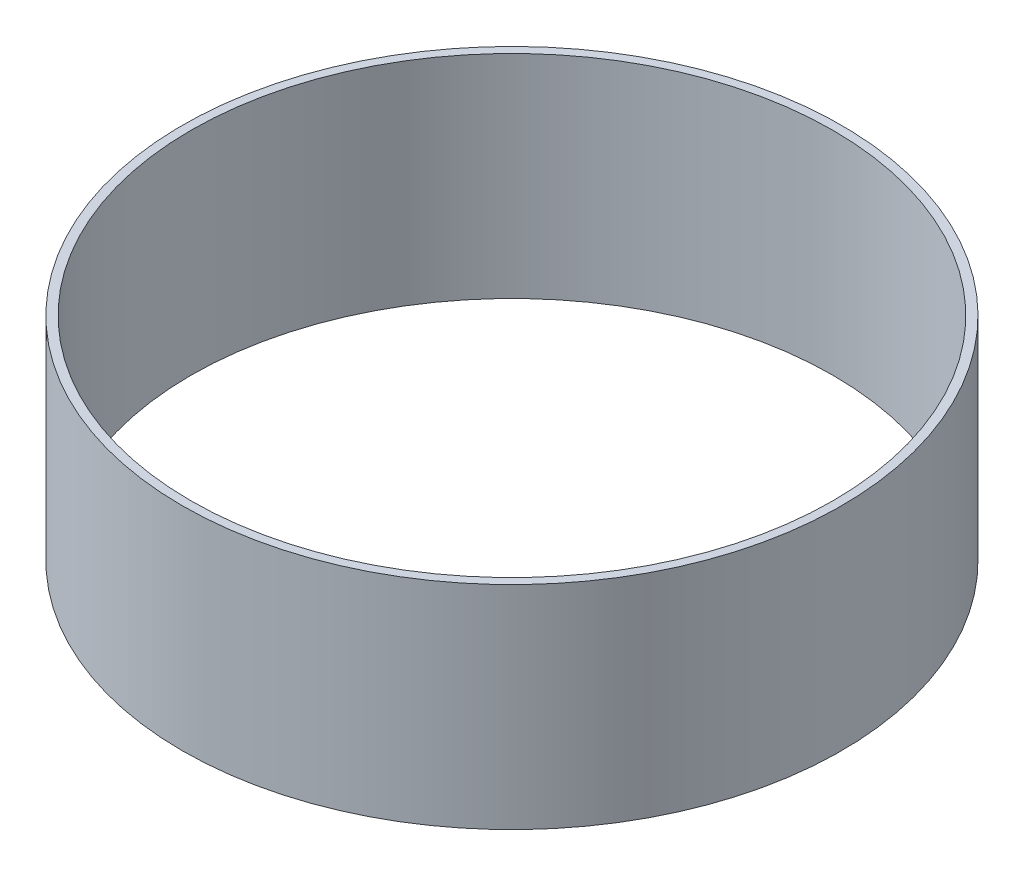
ISO-10303-21;
HEADER;
FILE_DESCRIPTION(('STEP AP214'),'2;1');
FILE_NAME('part.step','',(''),(''),'','','');
FILE_SCHEMA(('AUTOMOTIVE_DESIGN { 1 0 10303 214 1 1 1 1 }'));
ENDSEC;
DATA;
#1=APPLICATION_CONTEXT('core data for automotive mechanical design processes');
#2=APPLICATION_PROTOCOL_DEFINITION('international standard','automotive_design',2000,#1);
#3=PRODUCT_CONTEXT('',#1,'mechanical');
#4=PRODUCT('Part','Part','',(#3));
#5=PRODUCT_RELATED_PRODUCT_CATEGORY('part','',(#4));
#6=PRODUCT_DEFINITION_FORMATION('','',#4);
#7=PRODUCT_DEFINITION_CONTEXT('part definition',#1,'design');
#8=PRODUCT_DEFINITION('design','',#6,#7);
#9=PRODUCT_DEFINITION_SHAPE('','',#8);
#10=(LENGTH_UNIT() NAMED_UNIT(*) SI_UNIT(.MILLI.,.METRE.));
#11=(NAMED_UNIT(*) PLANE_ANGLE_UNIT() SI_UNIT($,.RADIAN.));
#12=(NAMED_UNIT(*) SI_UNIT($,.STERADIAN.) SOLID_ANGLE_UNIT());
#13=UNCERTAINTY_MEASURE_WITH_UNIT(LENGTH_MEASURE(1.E-05),#10,'distance_accuracy_value','');
#14=(GEOMETRIC_REPRESENTATION_CONTEXT(3) GLOBAL_UNCERTAINTY_ASSIGNED_CONTEXT((#13)) GLOBAL_UNIT_ASSIGNED_CONTEXT((#10,
#11,#12)) REPRESENTATION_CONTEXT('',''));
#15=CARTESIAN_POINT('',(0.,0.,0.));
#16=DIRECTION('',(0.,0.,1.));
#17=DIRECTION('',(1.,0.,0.));
#18=AXIS2_PLACEMENT_3D('',#15,#16,#17);
#19=CARTESIAN_POINT('',(0.,16.,0.));
#20=DIRECTION('',(0.,1.,0.));
#21=DIRECTION('',(0.,0.,1.));
#22=AXIS2_PLACEMENT_3D('',#19,#20,#21);
#23=PLANE('',#22);
#24=CARTESIAN_POINT('',(0.,16.,0.));
#25=DIRECTION('',(0.,1.,0.));
#26=DIRECTION('',(0.,0.,1.));
#27=AXIS2_PLACEMENT_3D('',#24,#25,#26);
#28=CIRCLE('',#27,24.85);
#29=CARTESIAN_POINT('',(0.,16.,24.85));
#30=VERTEX_POINT('',#29);
#31=EDGE_CURVE('E10',#30,#30,#28,.T.);
#32=ORIENTED_EDGE('',*,*,#31,.T.);
#33=EDGE_LOOP('',(#32));
#34=FACE_BOUND('',#33,.T.);
#35=CARTESIAN_POINT('',(0.,16.,0.));
#36=DIRECTION('',(0.,1.,0.));
#37=DIRECTION('',(0.,0.,1.));
#38=AXIS2_PLACEMENT_3D('',#35,#36,#37);
#39=CIRCLE('',#38,24.2);
#40=CARTESIAN_POINT('',(0.,16.,24.2));
#41=VERTEX_POINT('',#40);
#42=EDGE_CURVE('E42',#41,#41,#39,.T.);
#43=ORIENTED_EDGE('',*,*,#42,.F.);
#44=EDGE_LOOP('',(#43));
#45=FACE_BOUND('',#44,.T.);
#46=ADVANCED_FACE('F31',(#34,#45),#23,.T.);
#47=CARTESIAN_POINT('',(0.,0.,0.));
#48=DIRECTION('',(0.,1.,0.));
#49=DIRECTION('',(0.,0.,1.));
#50=AXIS2_PLACEMENT_3D('',#47,#48,#49);
#51=PLANE('',#50);
#52=CARTESIAN_POINT('',(0.,0.,0.));
#53=DIRECTION('',(0.,1.,0.));
#54=DIRECTION('',(0.,0.,1.));
#55=AXIS2_PLACEMENT_3D('',#52,#53,#54);
#56=CIRCLE('',#55,24.85);
#57=CARTESIAN_POINT('',(0.,0.,24.85));
#58=VERTEX_POINT('',#57);
#59=EDGE_CURVE('E35',#58,#58,#56,.T.);
#60=ORIENTED_EDGE('',*,*,#59,.F.);
#61=EDGE_LOOP('',(#60));
#62=FACE_BOUND('',#61,.T.);
#63=CARTESIAN_POINT('',(0.,0.,0.));
#64=DIRECTION('',(0.,1.,0.));
#65=DIRECTION('',(0.,0.,1.));
#66=AXIS2_PLACEMENT_3D('',#63,#64,#65);
#67=CIRCLE('',#66,24.2);
#68=CARTESIAN_POINT('',(0.,0.,24.2));
#69=VERTEX_POINT('',#68);
#70=EDGE_CURVE('E44',#69,#69,#67,.T.);
#71=ORIENTED_EDGE('',*,*,#70,.T.);
#72=EDGE_LOOP('',(#71));
#73=FACE_BOUND('',#72,.T.);
#74=ADVANCED_FACE('F54',(#62,#73),#51,.F.);
#75=CARTESIAN_POINT('',(0.,16.,0.));
#76=DIRECTION('',(0.,-1.,0.));
#77=DIRECTION('',(0.,0.,-1.));
#78=AXIS2_PLACEMENT_3D('',#75,#76,#77);
#79=CYLINDRICAL_SURFACE('',#78,24.85);
#80=ORIENTED_EDGE('',*,*,#31,.F.);
#81=EDGE_LOOP('',(#80));
#82=FACE_BOUND('',#81,.T.);
#83=ORIENTED_EDGE('',*,*,#59,.T.);
#84=EDGE_LOOP('',(#83));
#85=FACE_BOUND('',#84,.T.);
#86=ADVANCED_FACE('F33',(#82,#85),#79,.T.);
#87=CARTESIAN_POINT('',(0.,16.,0.));
#88=DIRECTION('',(0.,-1.,0.));
#89=DIRECTION('',(0.,0.,-1.));
#90=AXIS2_PLACEMENT_3D('',#87,#88,#89);
#91=CYLINDRICAL_SURFACE('',#90,24.2);
#92=ORIENTED_EDGE('',*,*,#42,.T.);
#93=EDGE_LOOP('',(#92));
#94=FACE_BOUND('',#93,.T.);
#95=ORIENTED_EDGE('',*,*,#70,.F.);
#96=EDGE_LOOP('',(#95));
#97=FACE_BOUND('',#96,.T.);
#98=ADVANCED_FACE('F50',(#94,#97),#91,.F.);
#99=CLOSED_SHELL('',(#46,#74,#86,#98));
#100=MANIFOLD_SOLID_BREP('B2',#99);
#101=ADVANCED_BREP_SHAPE_REPRESENTATION('',(#18,#100),#14);
#102=SHAPE_DEFINITION_REPRESENTATION(#9,#101);
ENDSEC;
END-ISO-10303-21;
